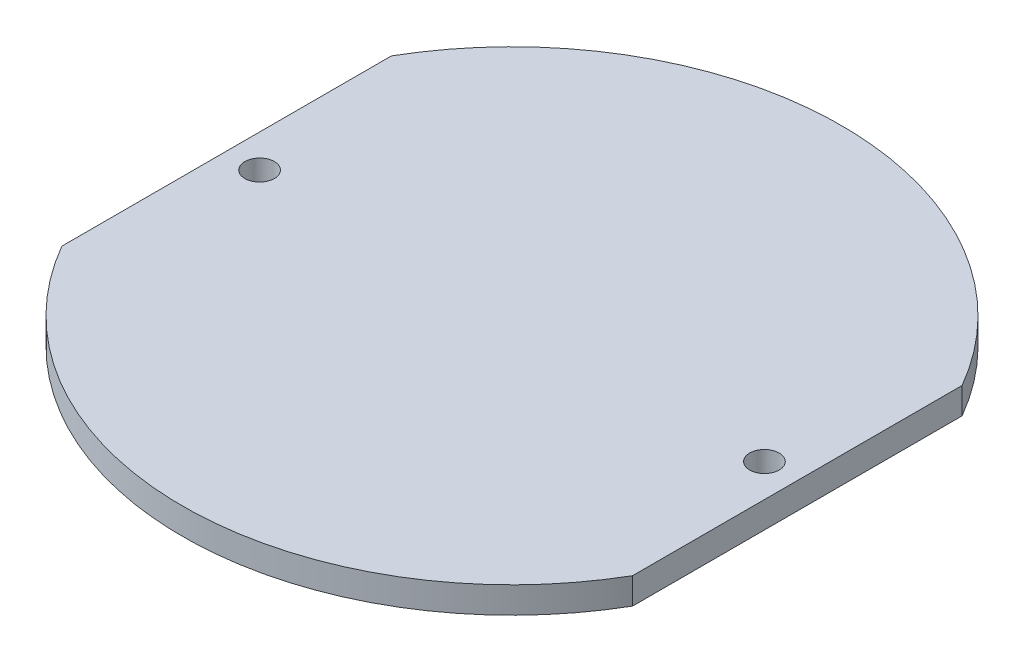
ISO-10303-21;
HEADER;
FILE_DESCRIPTION(('STEP AP214'),'2;1');
FILE_NAME('part.step','',(''),(''),'','','');
FILE_SCHEMA(('AUTOMOTIVE_DESIGN { 1 0 10303 214 1 1 1 1 }'));
ENDSEC;
DATA;
#1=APPLICATION_CONTEXT('core data for automotive mechanical design processes');
#2=APPLICATION_PROTOCOL_DEFINITION('international standard','automotive_design',2000,#1);
#3=PRODUCT_CONTEXT('',#1,'mechanical');
#4=PRODUCT('Part','Part','',(#3));
#5=PRODUCT_RELATED_PRODUCT_CATEGORY('part','',(#4));
#6=PRODUCT_DEFINITION_FORMATION('','',#4);
#7=PRODUCT_DEFINITION_CONTEXT('part definition',#1,'design');
#8=PRODUCT_DEFINITION('design','',#6,#7);
#9=PRODUCT_DEFINITION_SHAPE('','',#8);
#10=(LENGTH_UNIT() NAMED_UNIT(*) SI_UNIT(.MILLI.,.METRE.));
#11=(NAMED_UNIT(*) PLANE_ANGLE_UNIT() SI_UNIT($,.RADIAN.));
#12=(NAMED_UNIT(*) SI_UNIT($,.STERADIAN.) SOLID_ANGLE_UNIT());
#13=UNCERTAINTY_MEASURE_WITH_UNIT(LENGTH_MEASURE(1.E-05),#10,'distance_accuracy_value','');
#14=(GEOMETRIC_REPRESENTATION_CONTEXT(3) GLOBAL_UNCERTAINTY_ASSIGNED_CONTEXT((#13)) GLOBAL_UNIT_ASSIGNED_CONTEXT((#10,
#11,#12)) REPRESENTATION_CONTEXT('',''));
#15=CARTESIAN_POINT('',(0.,0.,0.));
#16=DIRECTION('',(0.,0.,1.));
#17=DIRECTION('',(1.,0.,0.));
#18=AXIS2_PLACEMENT_3D('',#15,#16,#17);
#19=CARTESIAN_POINT('',(0.,2.54,0.));
#20=DIRECTION('',(0.,1.,0.));
#21=DIRECTION('',(0.,0.,1.));
#22=AXIS2_PLACEMENT_3D('',#19,#20,#21);
#23=PLANE('',#22);
#24=CARTESIAN_POINT('',(-24.321306570156,2.54,0.));
#25=DIRECTION('',(0.,1.,0.));
#26=DIRECTION('',(0.,0.,1.));
#27=AXIS2_PLACEMENT_3D('',#24,#25,#26);
#28=CIRCLE('',#27,1.4224);
#29=CARTESIAN_POINT('',(-24.321306570156,2.54,1.4224));
#30=VERTEX_POINT('',#29);
#31=EDGE_CURVE('E100',#30,#30,#28,.T.);
#32=ORIENTED_EDGE('',*,*,#31,.F.);
#33=EDGE_LOOP('',(#32));
#34=FACE_BOUND('',#33,.T.);
#35=CARTESIAN_POINT('',(0.,2.54,0.));
#36=DIRECTION('',(0.,1.,0.));
#37=DIRECTION('',(0.,0.,1.));
#38=AXIS2_PLACEMENT_3D('',#35,#36,#37);
#39=CIRCLE('',#38,31.75);
#40=CARTESIAN_POINT('',(27.496306570156,2.54,-15.8749999999999));
#41=VERTEX_POINT('',#40);
#42=CARTESIAN_POINT('',(-27.496306570156,2.54,-15.8749999999999));
#43=VERTEX_POINT('',#42);
#44=EDGE_CURVE('E85',#41,#43,#39,.T.);
#45=ORIENTED_EDGE('',*,*,#44,.T.);
#46=DIRECTION('',(0.,0.,1.));
#47=VECTOR('',#46,1.);
#48=CARTESIAN_POINT('',(-27.496306570156,2.54,-15.8749999999999));
#49=LINE('',#48,#47);
#50=CARTESIAN_POINT('',(-27.496306570156,2.54,15.8749999999999));
#51=VERTEX_POINT('',#50);
#52=EDGE_CURVE('E80',#43,#51,#49,.T.);
#53=ORIENTED_EDGE('',*,*,#52,.T.);
#54=CARTESIAN_POINT('',(0.,2.54,0.));
#55=DIRECTION('',(0.,1.,0.));
#56=DIRECTION('',(0.,0.,1.));
#57=AXIS2_PLACEMENT_3D('',#54,#55,#56);
#58=CIRCLE('',#57,31.75);
#59=CARTESIAN_POINT('',(27.496306570156,2.54,15.8749999999999));
#60=VERTEX_POINT('',#59);
#61=EDGE_CURVE('E83',#51,#60,#58,.T.);
#62=ORIENTED_EDGE('',*,*,#61,.T.);
#63=DIRECTION('',(0.,0.,-1.));
#64=VECTOR('',#63,1.);
#65=CARTESIAN_POINT('',(27.496306570156,2.54,-15.8749999999999));
#66=LINE('',#65,#64);
#67=EDGE_CURVE('E50',#60,#41,#66,.T.);
#68=ORIENTED_EDGE('',*,*,#67,.T.);
#69=EDGE_LOOP('',(#45,#53,#62,#68));
#70=FACE_BOUND('',#69,.T.);
#71=CARTESIAN_POINT('',(24.321306570156,2.54,0.));
#72=DIRECTION('',(0.,1.,0.));
#73=DIRECTION('',(0.,0.,-1.));
#74=AXIS2_PLACEMENT_3D('',#71,#72,#73);
#75=CIRCLE('',#74,1.4224);
#76=CARTESIAN_POINT('',(24.321306570156,2.54,-1.4224));
#77=VERTEX_POINT('',#76);
#78=EDGE_CURVE('E115',#77,#77,#75,.T.);
#79=ORIENTED_EDGE('',*,*,#78,.F.);
#80=EDGE_LOOP('',(#79));
#81=FACE_BOUND('',#80,.T.);
#82=ADVANCED_FACE('F33',(#34,#70,#81),#23,.T.);
#83=CARTESIAN_POINT('',(0.,0.,0.));
#84=DIRECTION('',(0.,1.,0.));
#85=DIRECTION('',(0.,0.,1.));
#86=AXIS2_PLACEMENT_3D('',#83,#84,#85);
#87=PLANE('',#86);
#88=CARTESIAN_POINT('',(-24.321306570156,0.,0.));
#89=DIRECTION('',(0.,1.,0.));
#90=DIRECTION('',(0.,0.,1.));
#91=AXIS2_PLACEMENT_3D('',#88,#89,#90);
#92=CIRCLE('',#91,1.4224);
#93=CARTESIAN_POINT('',(-24.321306570156,0.,1.4224));
#94=VERTEX_POINT('',#93);
#95=EDGE_CURVE('E112',#94,#94,#92,.T.);
#96=ORIENTED_EDGE('',*,*,#95,.T.);
#97=EDGE_LOOP('',(#96));
#98=FACE_BOUND('',#97,.T.);
#99=CARTESIAN_POINT('',(0.,0.,0.));
#100=DIRECTION('',(0.,1.,0.));
#101=DIRECTION('',(0.,0.,1.));
#102=AXIS2_PLACEMENT_3D('',#99,#100,#101);
#103=CIRCLE('',#102,31.75);
#104=CARTESIAN_POINT('',(27.496306570156,0.,-15.8749999999999));
#105=VERTEX_POINT('',#104);
#106=CARTESIAN_POINT('',(-27.496306570156,0.,-15.8749999999999));
#107=VERTEX_POINT('',#106);
#108=EDGE_CURVE('E97',#105,#107,#103,.T.);
#109=ORIENTED_EDGE('',*,*,#108,.F.);
#110=DIRECTION('',(0.,0.,-1.));
#111=VECTOR('',#110,1.);
#112=CARTESIAN_POINT('',(27.496306570156,0.,-15.8749999999999));
#113=LINE('',#112,#111);
#114=CARTESIAN_POINT('',(27.496306570156,0.,15.8749999999999));
#115=VERTEX_POINT('',#114);
#116=EDGE_CURVE('E73',#115,#105,#113,.T.);
#117=ORIENTED_EDGE('',*,*,#116,.F.);
#118=CARTESIAN_POINT('',(0.,0.,0.));
#119=DIRECTION('',(0.,1.,0.));
#120=DIRECTION('',(0.,0.,1.));
#121=AXIS2_PLACEMENT_3D('',#118,#119,#120);
#122=CIRCLE('',#121,31.75);
#123=CARTESIAN_POINT('',(-27.496306570156,0.,15.8749999999999));
#124=VERTEX_POINT('',#123);
#125=EDGE_CURVE('E67',#124,#115,#122,.T.);
#126=ORIENTED_EDGE('',*,*,#125,.F.);
#127=DIRECTION('',(0.,0.,1.));
#128=VECTOR('',#127,1.);
#129=CARTESIAN_POINT('',(-27.496306570156,0.,-15.8749999999999));
#130=LINE('',#129,#128);
#131=EDGE_CURVE('E89',#107,#124,#130,.T.);
#132=ORIENTED_EDGE('',*,*,#131,.F.);
#133=EDGE_LOOP('',(#109,#117,#126,#132));
#134=FACE_BOUND('',#133,.T.);
#135=CARTESIAN_POINT('',(24.321306570156,0.,0.));
#136=DIRECTION('',(0.,1.,0.));
#137=DIRECTION('',(0.,0.,-1.));
#138=AXIS2_PLACEMENT_3D('',#135,#136,#137);
#139=CIRCLE('',#138,1.4224);
#140=CARTESIAN_POINT('',(24.321306570156,0.,-1.4224));
#141=VERTEX_POINT('',#140);
#142=EDGE_CURVE('E118',#141,#141,#139,.T.);
#143=ORIENTED_EDGE('',*,*,#142,.T.);
#144=EDGE_LOOP('',(#143));
#145=FACE_BOUND('',#144,.T.);
#146=ADVANCED_FACE('F108',(#98,#134,#145),#87,.F.);
#147=CARTESIAN_POINT('',(0.,2.54,0.));
#148=DIRECTION('',(0.,-1.,0.));
#149=DIRECTION('',(0.,0.,-1.));
#150=AXIS2_PLACEMENT_3D('',#147,#148,#149);
#151=CYLINDRICAL_SURFACE('',#150,31.75);
#152=ORIENTED_EDGE('',*,*,#108,.T.);
#153=DIRECTION('',(0.,-1.,0.));
#154=VECTOR('',#153,1.);
#155=CARTESIAN_POINT('',(-27.496306570156,2.54,-15.8749999999999));
#156=LINE('',#155,#154);
#157=EDGE_CURVE('E11',#43,#107,#156,.T.);
#158=ORIENTED_EDGE('',*,*,#157,.F.);
#159=ORIENTED_EDGE('',*,*,#44,.F.);
#160=DIRECTION('',(0.,-1.,0.));
#161=VECTOR('',#160,1.);
#162=CARTESIAN_POINT('',(27.496306570156,2.54,-15.8749999999999));
#163=LINE('',#162,#161);
#164=EDGE_CURVE('E93',#41,#105,#163,.T.);
#165=ORIENTED_EDGE('',*,*,#164,.T.);
#166=EDGE_LOOP('',(#152,#158,#159,#165));
#167=FACE_BOUND('',#166,.T.);
#168=ADVANCED_FACE('F35',(#167),#151,.T.);
#169=CARTESIAN_POINT('',(-27.496306570156,2.54,-15.8749999999999));
#170=DIRECTION('',(1.,0.,0.));
#171=DIRECTION('',(0.,0.,-1.));
#172=AXIS2_PLACEMENT_3D('',#169,#170,#171);
#173=PLANE('',#172);
#174=ORIENTED_EDGE('',*,*,#131,.T.);
#175=DIRECTION('',(0.,-1.,0.));
#176=VECTOR('',#175,1.);
#177=CARTESIAN_POINT('',(-27.496306570156,2.54,15.8749999999999));
#178=LINE('',#177,#176);
#179=EDGE_CURVE('E42',#51,#124,#178,.T.);
#180=ORIENTED_EDGE('',*,*,#179,.F.);
#181=ORIENTED_EDGE('',*,*,#52,.F.);
#182=ORIENTED_EDGE('',*,*,#157,.T.);
#183=EDGE_LOOP('',(#174,#180,#181,#182));
#184=FACE_BOUND('',#183,.T.);
#185=ADVANCED_FACE('F88',(#184),#173,.F.);
#186=CARTESIAN_POINT('',(0.,2.54,0.));
#187=DIRECTION('',(0.,-1.,0.));
#188=DIRECTION('',(0.,0.,-1.));
#189=AXIS2_PLACEMENT_3D('',#186,#187,#188);
#190=CYLINDRICAL_SURFACE('',#189,31.75);
#191=ORIENTED_EDGE('',*,*,#125,.T.);
#192=DIRECTION('',(0.,-1.,0.));
#193=VECTOR('',#192,1.);
#194=CARTESIAN_POINT('',(27.496306570156,2.54,15.8749999999999));
#195=LINE('',#194,#193);
#196=EDGE_CURVE('E90',#60,#115,#195,.T.);
#197=ORIENTED_EDGE('',*,*,#196,.F.);
#198=ORIENTED_EDGE('',*,*,#61,.F.);
#199=ORIENTED_EDGE('',*,*,#179,.T.);
#200=EDGE_LOOP('',(#191,#197,#198,#199));
#201=FACE_BOUND('',#200,.T.);
#202=ADVANCED_FACE('F91',(#201),#190,.T.);
#203=CARTESIAN_POINT('',(27.496306570156,2.54,-15.8749999999999));
#204=DIRECTION('',(-1.,0.,0.));
#205=DIRECTION('',(0.,0.,1.));
#206=AXIS2_PLACEMENT_3D('',#203,#204,#205);
#207=PLANE('',#206);
#208=ORIENTED_EDGE('',*,*,#116,.T.);
#209=ORIENTED_EDGE('',*,*,#164,.F.);
#210=ORIENTED_EDGE('',*,*,#67,.F.);
#211=ORIENTED_EDGE('',*,*,#196,.T.);
#212=EDGE_LOOP('',(#208,#209,#210,#211));
#213=FACE_BOUND('',#212,.T.);
#214=ADVANCED_FACE('F105',(#213),#207,.F.);
#215=CARTESIAN_POINT('',(-24.321306570156,2.54,0.));
#216=DIRECTION('',(0.,-1.,0.));
#217=DIRECTION('',(0.,0.,-1.));
#218=AXIS2_PLACEMENT_3D('',#215,#216,#217);
#219=CYLINDRICAL_SURFACE('',#218,1.4224);
#220=ORIENTED_EDGE('',*,*,#31,.T.);
#221=EDGE_LOOP('',(#220));
#222=FACE_BOUND('',#221,.T.);
#223=ORIENTED_EDGE('',*,*,#95,.F.);
#224=EDGE_LOOP('',(#223));
#225=FACE_BOUND('',#224,.T.);
#226=ADVANCED_FACE('F136',(#222,#225),#219,.F.);
#227=CARTESIAN_POINT('',(24.321306570156,2.54,0.));
#228=DIRECTION('',(0.,-1.,0.));
#229=DIRECTION('',(0.,0.,-1.));
#230=AXIS2_PLACEMENT_3D('',#227,#228,#229);
#231=CYLINDRICAL_SURFACE('',#230,1.4224);
#232=ORIENTED_EDGE('',*,*,#78,.T.);
#233=EDGE_LOOP('',(#232));
#234=FACE_BOUND('',#233,.T.);
#235=ORIENTED_EDGE('',*,*,#142,.F.);
#236=EDGE_LOOP('',(#235));
#237=FACE_BOUND('',#236,.T.);
#238=ADVANCED_FACE('F124',(#234,#237),#231,.F.);
#239=CLOSED_SHELL('',(#82,#146,#168,#185,#202,#214,#226,#238));
#240=MANIFOLD_SOLID_BREP('B2',#239);
#241=ADVANCED_BREP_SHAPE_REPRESENTATION('',(#18,#240),#14);
#242=SHAPE_DEFINITION_REPRESENTATION(#9,#241);
ENDSEC;
END-ISO-10303-21;
